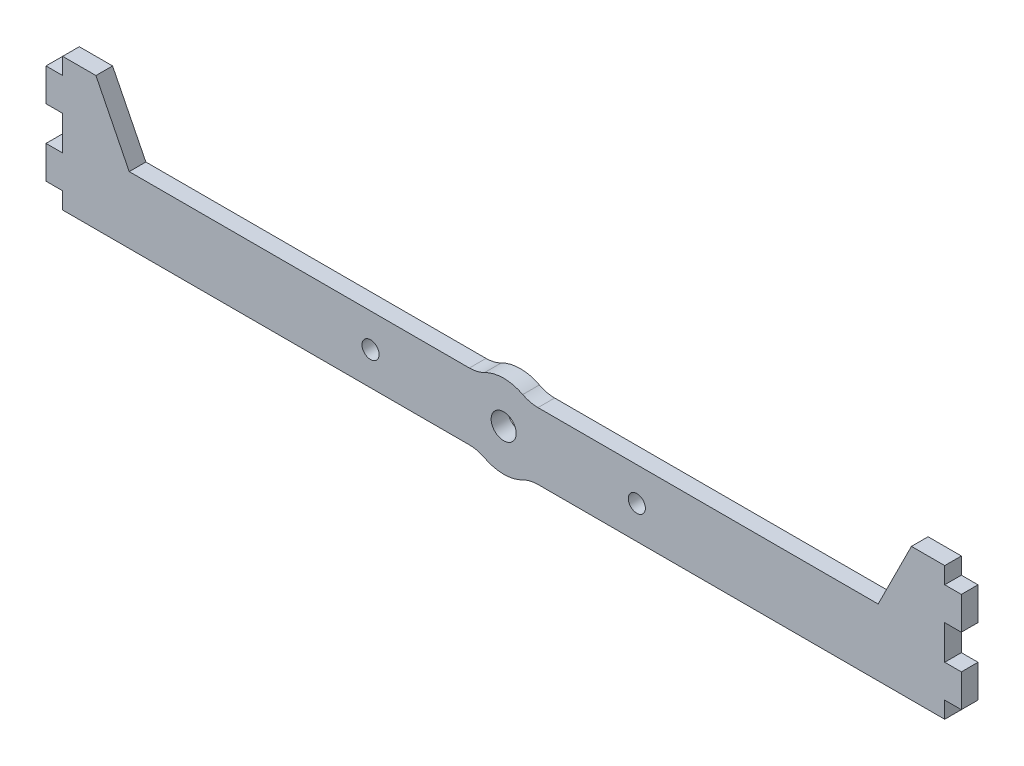
ISO-10303-21;
HEADER;
FILE_DESCRIPTION(('STEP AP214'),'2;1');
FILE_NAME('part.step','',(''),(''),'','','');
FILE_SCHEMA(('AUTOMOTIVE_DESIGN { 1 0 10303 214 1 1 1 1 }'));
ENDSEC;
DATA;
#1=APPLICATION_CONTEXT('core data for automotive mechanical design processes');
#2=APPLICATION_PROTOCOL_DEFINITION('international standard','automotive_design',2000,#1);
#3=PRODUCT_CONTEXT('',#1,'mechanical');
#4=PRODUCT('Part','Part','',(#3));
#5=PRODUCT_RELATED_PRODUCT_CATEGORY('part','',(#4));
#6=PRODUCT_DEFINITION_FORMATION('','',#4);
#7=PRODUCT_DEFINITION_CONTEXT('part definition',#1,'design');
#8=PRODUCT_DEFINITION('design','',#6,#7);
#9=PRODUCT_DEFINITION_SHAPE('','',#8);
#10=(LENGTH_UNIT() NAMED_UNIT(*) SI_UNIT(.MILLI.,.METRE.));
#11=(NAMED_UNIT(*) PLANE_ANGLE_UNIT() SI_UNIT($,.RADIAN.));
#12=(NAMED_UNIT(*) SI_UNIT($,.STERADIAN.) SOLID_ANGLE_UNIT());
#13=UNCERTAINTY_MEASURE_WITH_UNIT(LENGTH_MEASURE(1.E-05),#10,'distance_accuracy_value','');
#14=(GEOMETRIC_REPRESENTATION_CONTEXT(3) GLOBAL_UNCERTAINTY_ASSIGNED_CONTEXT((#13)) GLOBAL_UNIT_ASSIGNED_CONTEXT((#10,
#11,#12)) REPRESENTATION_CONTEXT('',''));
#15=CARTESIAN_POINT('',(0.,0.,0.));
#16=DIRECTION('',(0.,0.,1.));
#17=DIRECTION('',(1.,0.,0.));
#18=AXIS2_PLACEMENT_3D('',#15,#16,#17);
#19=CARTESIAN_POINT('',(0.,-12.7,6.35));
#20=DIRECTION('',(0.,-1.,0.));
#21=DIRECTION('',(1.,0.,0.));
#22=AXIS2_PLACEMENT_3D('',#19,#20,#21);
#23=PLANE('',#22);
#24=DIRECTION('',(-1.,0.,0.));
#25=VECTOR('',#24,1.);
#26=CARTESIAN_POINT('',(0.,-12.7,0.));
#27=LINE('',#26,#25);
#28=CARTESIAN_POINT('',(-13.0908603613361,-12.7,0.));
#29=VERTEX_POINT('',#28);
#30=CARTESIAN_POINT('',(-168.275,-12.7,0.));
#31=VERTEX_POINT('',#30);
#32=EDGE_CURVE('E337',#29,#31,#27,.T.);
#33=ORIENTED_EDGE('',*,*,#32,.F.);
#34=DIRECTION('',(0.,0.,-1.));
#35=VECTOR('',#34,1.);
#36=CARTESIAN_POINT('',(-13.0908603613361,-12.7,6.35));
#37=LINE('',#36,#35);
#38=CARTESIAN_POINT('',(-13.0908603613361,-12.7,6.35));
#39=VERTEX_POINT('',#38);
#40=EDGE_CURVE('E467',#29,#39,#37,.F.);
#41=ORIENTED_EDGE('',*,*,#40,.T.);
#42=DIRECTION('',(-1.,0.,0.));
#43=VECTOR('',#42,1.);
#44=CARTESIAN_POINT('',(0.,-12.7,6.35));
#45=LINE('',#44,#43);
#46=CARTESIAN_POINT('',(-168.275,-12.7,6.35));
#47=VERTEX_POINT('',#46);
#48=EDGE_CURVE('E273',#39,#47,#45,.T.);
#49=ORIENTED_EDGE('',*,*,#48,.T.);
#50=DIRECTION('',(0.,0.,-1.));
#51=VECTOR('',#50,1.);
#52=CARTESIAN_POINT('',(-168.275,-12.7,6.35));
#53=LINE('',#52,#51);
#54=EDGE_CURVE('E336',#47,#31,#53,.T.);
#55=ORIENTED_EDGE('',*,*,#54,.T.);
#56=EDGE_LOOP('',(#33,#41,#49,#55));
#57=FACE_BOUND('',#56,.T.);
#58=ADVANCED_FACE('F37',(#57),#23,.T.);
#59=CARTESIAN_POINT('',(0.,0.,6.35));
#60=DIRECTION('',(0.,0.,-1.));
#61=DIRECTION('',(-1.,0.,0.));
#62=AXIS2_PLACEMENT_3D('',#59,#60,#61);
#63=CYLINDRICAL_SURFACE('',#62,15.875);
#64=CARTESIAN_POINT('',(0.,0.,6.35));
#65=DIRECTION('',(0.,0.,1.));
#66=DIRECTION('',(1.,0.,0.));
#67=AXIS2_PLACEMENT_3D('',#64,#65,#66);
#68=CIRCLE('',#67,15.875);
#69=CARTESIAN_POINT('',(-7.27270020074232,-14.1111111111111,6.35));
#70=VERTEX_POINT('',#69);
#71=CARTESIAN_POINT('',(7.27270020074221,-14.1111111111111,6.35));
#72=VERTEX_POINT('',#71);
#73=EDGE_CURVE('E271',#70,#72,#68,.T.);
#74=ORIENTED_EDGE('',*,*,#73,.F.);
#75=DIRECTION('',(0.,0.,-1.));
#76=VECTOR('',#75,1.);
#77=CARTESIAN_POINT('',(-7.27270020074232,-14.1111111111111,6.35));
#78=LINE('',#77,#76);
#79=CARTESIAN_POINT('',(-7.27270020074232,-14.1111111111111,0.));
#80=VERTEX_POINT('',#79);
#81=EDGE_CURVE('E464',#70,#80,#78,.T.);
#82=ORIENTED_EDGE('',*,*,#81,.T.);
#83=CARTESIAN_POINT('',(0.,0.,0.));
#84=DIRECTION('',(0.,0.,1.));
#85=DIRECTION('',(1.,0.,0.));
#86=AXIS2_PLACEMENT_3D('',#83,#84,#85);
#87=CIRCLE('',#86,15.875);
#88=CARTESIAN_POINT('',(7.27270020074221,-14.1111111111111,0.));
#89=VERTEX_POINT('',#88);
#90=EDGE_CURVE('E339',#80,#89,#87,.T.);
#91=ORIENTED_EDGE('',*,*,#90,.T.);
#92=DIRECTION('',(0.,0.,-1.));
#93=VECTOR('',#92,1.);
#94=CARTESIAN_POINT('',(7.27270020074221,-14.1111111111111,6.35));
#95=LINE('',#94,#93);
#96=EDGE_CURVE('E256',#89,#72,#95,.F.);
#97=ORIENTED_EDGE('',*,*,#96,.T.);
#98=EDGE_LOOP('',(#74,#82,#91,#97));
#99=FACE_BOUND('',#98,.T.);
#100=ADVANCED_FACE('F556',(#99),#63,.T.);
#101=CARTESIAN_POINT('',(0.,-12.7,6.35));
#102=DIRECTION('',(0.,-1.,0.));
#103=DIRECTION('',(1.,0.,0.));
#104=AXIS2_PLACEMENT_3D('',#101,#102,#103);
#105=PLANE('',#104);
#106=DIRECTION('',(-1.,0.,0.));
#107=VECTOR('',#106,1.);
#108=CARTESIAN_POINT('',(0.,-12.7,6.35));
#109=LINE('',#108,#107);
#110=CARTESIAN_POINT('',(168.275,-12.7,6.35));
#111=VERTEX_POINT('',#110);
#112=CARTESIAN_POINT('',(13.090860361336,-12.7,6.35));
#113=VERTEX_POINT('',#112);
#114=EDGE_CURVE('E250',#111,#113,#109,.T.);
#115=ORIENTED_EDGE('',*,*,#114,.T.);
#116=DIRECTION('',(0.,0.,-1.));
#117=VECTOR('',#116,1.);
#118=CARTESIAN_POINT('',(13.090860361336,-12.7,6.35));
#119=LINE('',#118,#117);
#120=CARTESIAN_POINT('',(13.090860361336,-12.7,0.));
#121=VERTEX_POINT('',#120);
#122=EDGE_CURVE('E469',#113,#121,#119,.T.);
#123=ORIENTED_EDGE('',*,*,#122,.T.);
#124=DIRECTION('',(-1.,0.,0.));
#125=VECTOR('',#124,1.);
#126=CARTESIAN_POINT('',(0.,-12.7,0.));
#127=LINE('',#126,#125);
#128=CARTESIAN_POINT('',(168.275,-12.7,0.));
#129=VERTEX_POINT('',#128);
#130=EDGE_CURVE('E253',#129,#121,#127,.T.);
#131=ORIENTED_EDGE('',*,*,#130,.F.);
#132=DIRECTION('',(0.,0.,-1.));
#133=VECTOR('',#132,1.);
#134=CARTESIAN_POINT('',(168.275,-12.7,6.35));
#135=LINE('',#134,#133);
#136=EDGE_CURVE('E245',#111,#129,#135,.T.);
#137=ORIENTED_EDGE('',*,*,#136,.F.);
#138=EDGE_LOOP('',(#115,#123,#131,#137));
#139=FACE_BOUND('',#138,.T.);
#140=ADVANCED_FACE('F247',(#139),#105,.T.);
#141=CARTESIAN_POINT('',(168.275,-2.94209101525652E-12,6.35));
#142=DIRECTION('',(-1.,0.,0.));
#143=DIRECTION('',(0.,-1.,0.));
#144=AXIS2_PLACEMENT_3D('',#141,#142,#143);
#145=PLANE('',#144);
#146=DIRECTION('',(0.,1.,0.));
#147=VECTOR('',#146,1.);
#148=CARTESIAN_POINT('',(168.275,-2.94209101525652E-12,0.));
#149=LINE('',#148,#147);
#150=CARTESIAN_POINT('',(168.275,-6.34999999999966,0.));
#151=VERTEX_POINT('',#150);
#152=EDGE_CURVE('E344',#129,#151,#149,.T.);
#153=ORIENTED_EDGE('',*,*,#152,.T.);
#154=DIRECTION('',(0.,0.,-1.));
#155=VECTOR('',#154,1.);
#156=CARTESIAN_POINT('',(168.275,-6.34999999999966,6.35));
#157=LINE('',#156,#155);
#158=CARTESIAN_POINT('',(168.275,-6.34999999999966,6.35));
#159=VERTEX_POINT('',#158);
#160=EDGE_CURVE('E257',#159,#151,#157,.T.);
#161=ORIENTED_EDGE('',*,*,#160,.F.);
#162=DIRECTION('',(0.,1.,0.));
#163=VECTOR('',#162,1.);
#164=CARTESIAN_POINT('',(168.275,-2.94209101525652E-12,6.35));
#165=LINE('',#164,#163);
#166=EDGE_CURVE('E260',#111,#159,#165,.T.);
#167=ORIENTED_EDGE('',*,*,#166,.F.);
#168=ORIENTED_EDGE('',*,*,#136,.T.);
#169=EDGE_LOOP('',(#153,#161,#167,#168));
#170=FACE_BOUND('',#169,.T.);
#171=ADVANCED_FACE('F261',(#170),#145,.F.);
#172=CARTESIAN_POINT('',(0.,-6.35000000000003,6.35));
#173=DIRECTION('',(0.,1.,0.));
#174=DIRECTION('',(-1.,0.,0.));
#175=AXIS2_PLACEMENT_3D('',#172,#173,#174);
#176=PLANE('',#175);
#177=DIRECTION('',(1.,0.,0.));
#178=VECTOR('',#177,1.);
#179=CARTESIAN_POINT('',(0.,-6.35000000000003,0.));
#180=LINE('',#179,#178);
#181=CARTESIAN_POINT('',(174.625,-6.34999999999965,0.));
#182=VERTEX_POINT('',#181);
#183=EDGE_CURVE('E346',#151,#182,#180,.T.);
#184=ORIENTED_EDGE('',*,*,#183,.T.);
#185=DIRECTION('',(0.,0.,-1.));
#186=VECTOR('',#185,1.);
#187=CARTESIAN_POINT('',(174.625,-6.34999999999965,6.35));
#188=LINE('',#187,#186);
#189=CARTESIAN_POINT('',(174.625,-6.34999999999965,6.35));
#190=VERTEX_POINT('',#189);
#191=EDGE_CURVE('E459',#190,#182,#188,.T.);
#192=ORIENTED_EDGE('',*,*,#191,.F.);
#193=DIRECTION('',(1.,0.,0.));
#194=VECTOR('',#193,1.);
#195=CARTESIAN_POINT('',(0.,-6.35000000000003,6.35));
#196=LINE('',#195,#194);
#197=EDGE_CURVE('E264',#159,#190,#196,.T.);
#198=ORIENTED_EDGE('',*,*,#197,.F.);
#199=ORIENTED_EDGE('',*,*,#160,.T.);
#200=EDGE_LOOP('',(#184,#192,#198,#199));
#201=FACE_BOUND('',#200,.T.);
#202=ADVANCED_FACE('F582',(#201),#176,.F.);
#203=CARTESIAN_POINT('',(174.625,7.75490782700672E-13,6.35));
#204=DIRECTION('',(-1.,0.,0.));
#205=DIRECTION('',(0.,-1.,0.));
#206=AXIS2_PLACEMENT_3D('',#203,#204,#205);
#207=PLANE('',#206);
#208=DIRECTION('',(0.,1.,0.));
#209=VECTOR('',#208,1.);
#210=CARTESIAN_POINT('',(174.625,7.75490782700672E-13,0.));
#211=LINE('',#210,#209);
#212=CARTESIAN_POINT('',(174.625,6.15000000000035,0.));
#213=VERTEX_POINT('',#212);
#214=EDGE_CURVE('E348',#182,#213,#211,.T.);
#215=ORIENTED_EDGE('',*,*,#214,.T.);
#216=DIRECTION('',(0.,0.,-1.));
#217=VECTOR('',#216,1.);
#218=CARTESIAN_POINT('',(174.625,6.15000000000035,6.35));
#219=LINE('',#218,#217);
#220=CARTESIAN_POINT('',(174.625,6.15000000000035,6.35));
#221=VERTEX_POINT('',#220);
#222=EDGE_CURVE('E457',#221,#213,#219,.T.);
#223=ORIENTED_EDGE('',*,*,#222,.F.);
#224=DIRECTION('',(0.,1.,0.));
#225=VECTOR('',#224,1.);
#226=CARTESIAN_POINT('',(174.625,7.75490782700672E-13,6.35));
#227=LINE('',#226,#225);
#228=EDGE_CURVE('E278',#190,#221,#227,.T.);
#229=ORIENTED_EDGE('',*,*,#228,.F.);
#230=ORIENTED_EDGE('',*,*,#191,.T.);
#231=EDGE_LOOP('',(#215,#223,#229,#230));
#232=FACE_BOUND('',#231,.T.);
#233=ADVANCED_FACE('F585',(#232),#207,.F.);
#234=CARTESIAN_POINT('',(0.,6.15000000000002,6.35));
#235=DIRECTION('',(0.,1.,0.));
#236=DIRECTION('',(-1.,0.,0.));
#237=AXIS2_PLACEMENT_3D('',#234,#235,#236);
#238=PLANE('',#237);
#239=DIRECTION('',(1.,0.,0.));
#240=VECTOR('',#239,1.);
#241=CARTESIAN_POINT('',(0.,6.15000000000002,0.));
#242=LINE('',#241,#240);
#243=CARTESIAN_POINT('',(168.275,6.15000000000034,0.));
#244=VERTEX_POINT('',#243);
#245=EDGE_CURVE('E351',#244,#213,#242,.T.);
#246=ORIENTED_EDGE('',*,*,#245,.F.);
#247=DIRECTION('',(0.,0.,-1.));
#248=VECTOR('',#247,1.);
#249=CARTESIAN_POINT('',(168.275,6.15000000000034,6.35));
#250=LINE('',#249,#248);
#251=CARTESIAN_POINT('',(168.275,6.15000000000034,6.35));
#252=VERTEX_POINT('',#251);
#253=EDGE_CURVE('E455',#252,#244,#250,.T.);
#254=ORIENTED_EDGE('',*,*,#253,.F.);
#255=DIRECTION('',(1.,0.,0.));
#256=VECTOR('',#255,1.);
#257=CARTESIAN_POINT('',(0.,6.15000000000002,6.35));
#258=LINE('',#257,#256);
#259=EDGE_CURVE('E280',#252,#221,#258,.T.);
#260=ORIENTED_EDGE('',*,*,#259,.T.);
#261=ORIENTED_EDGE('',*,*,#222,.T.);
#262=EDGE_LOOP('',(#246,#254,#260,#261));
#263=FACE_BOUND('',#262,.T.);
#264=ADVANCED_FACE('F589',(#263),#238,.T.);
#265=CARTESIAN_POINT('',(168.275,1.42612808754815E-12,6.35));
#266=DIRECTION('',(-1.,0.,0.));
#267=DIRECTION('',(0.,-1.,0.));
#268=AXIS2_PLACEMENT_3D('',#265,#266,#267);
#269=PLANE('',#268);
#270=DIRECTION('',(0.,1.,0.));
#271=VECTOR('',#270,1.);
#272=CARTESIAN_POINT('',(168.275,1.42612808754815E-12,0.));
#273=LINE('',#272,#271);
#274=CARTESIAN_POINT('',(168.275,19.2500000000003,0.));
#275=VERTEX_POINT('',#274);
#276=EDGE_CURVE('E354',#244,#275,#273,.T.);
#277=ORIENTED_EDGE('',*,*,#276,.T.);
#278=DIRECTION('',(0.,0.,-1.));
#279=VECTOR('',#278,1.);
#280=CARTESIAN_POINT('',(168.275,19.2500000000003,6.35));
#281=LINE('',#280,#279);
#282=CARTESIAN_POINT('',(168.275,19.2500000000003,6.35));
#283=VERTEX_POINT('',#282);
#284=EDGE_CURVE('E452',#283,#275,#281,.T.);
#285=ORIENTED_EDGE('',*,*,#284,.F.);
#286=DIRECTION('',(0.,1.,0.));
#287=VECTOR('',#286,1.);
#288=CARTESIAN_POINT('',(168.275,1.42612808754815E-12,6.35));
#289=LINE('',#288,#287);
#290=EDGE_CURVE('E283',#252,#283,#289,.T.);
#291=ORIENTED_EDGE('',*,*,#290,.F.);
#292=ORIENTED_EDGE('',*,*,#253,.T.);
#293=EDGE_LOOP('',(#277,#285,#291,#292));
#294=FACE_BOUND('',#293,.T.);
#295=ADVANCED_FACE('F593',(#294),#269,.F.);
#296=CARTESIAN_POINT('',(0.,19.25,6.35));
#297=DIRECTION('',(0.,1.,0.));
#298=DIRECTION('',(-1.,0.,0.));
#299=AXIS2_PLACEMENT_3D('',#296,#297,#298);
#300=PLANE('',#299);
#301=DIRECTION('',(1.,0.,0.));
#302=VECTOR('',#301,1.);
#303=CARTESIAN_POINT('',(0.,19.25,0.));
#304=LINE('',#303,#302);
#305=CARTESIAN_POINT('',(174.625,19.2500000000004,0.));
#306=VERTEX_POINT('',#305);
#307=EDGE_CURVE('E356',#275,#306,#304,.T.);
#308=ORIENTED_EDGE('',*,*,#307,.T.);
#309=DIRECTION('',(0.,0.,-1.));
#310=VECTOR('',#309,1.);
#311=CARTESIAN_POINT('',(174.625,19.2500000000004,6.35));
#312=LINE('',#311,#310);
#313=CARTESIAN_POINT('',(174.625,19.2500000000004,6.35));
#314=VERTEX_POINT('',#313);
#315=EDGE_CURVE('E450',#314,#306,#312,.T.);
#316=ORIENTED_EDGE('',*,*,#315,.F.);
#317=DIRECTION('',(1.,0.,0.));
#318=VECTOR('',#317,1.);
#319=CARTESIAN_POINT('',(0.,19.25,6.35));
#320=LINE('',#319,#318);
#321=EDGE_CURVE('E285',#283,#314,#320,.T.);
#322=ORIENTED_EDGE('',*,*,#321,.F.);
#323=ORIENTED_EDGE('',*,*,#284,.T.);
#324=EDGE_LOOP('',(#308,#316,#322,#323));
#325=FACE_BOUND('',#324,.T.);
#326=ADVANCED_FACE('F597',(#325),#300,.F.);
#327=CARTESIAN_POINT('',(174.625,7.75490782700672E-13,6.35));
#328=DIRECTION('',(1.,0.,0.));
#329=DIRECTION('',(0.,1.,0.));
#330=AXIS2_PLACEMENT_3D('',#327,#328,#329);
#331=PLANE('',#330);
#332=DIRECTION('',(0.,-1.,0.));
#333=VECTOR('',#332,1.);
#334=CARTESIAN_POINT('',(174.625,7.75490782700672E-13,0.));
#335=LINE('',#334,#333);
#336=CARTESIAN_POINT('',(174.625,31.7500000000004,0.));
#337=VERTEX_POINT('',#336);
#338=EDGE_CURVE('E359',#337,#306,#335,.T.);
#339=ORIENTED_EDGE('',*,*,#338,.F.);
#340=DIRECTION('',(0.,0.,-1.));
#341=VECTOR('',#340,1.);
#342=CARTESIAN_POINT('',(174.625,31.7500000000004,6.35));
#343=LINE('',#342,#341);
#344=CARTESIAN_POINT('',(174.625,31.7500000000004,6.35));
#345=VERTEX_POINT('',#344);
#346=EDGE_CURVE('E448',#345,#337,#343,.T.);
#347=ORIENTED_EDGE('',*,*,#346,.F.);
#348=DIRECTION('',(0.,-1.,0.));
#349=VECTOR('',#348,1.);
#350=CARTESIAN_POINT('',(174.625,7.75490782700672E-13,6.35));
#351=LINE('',#350,#349);
#352=EDGE_CURVE('E287',#345,#314,#351,.T.);
#353=ORIENTED_EDGE('',*,*,#352,.T.);
#354=ORIENTED_EDGE('',*,*,#315,.T.);
#355=EDGE_LOOP('',(#339,#347,#353,#354));
#356=FACE_BOUND('',#355,.T.);
#357=ADVANCED_FACE('F601',(#356),#331,.T.);
#358=CARTESIAN_POINT('',(0.,31.75,6.35));
#359=DIRECTION('',(0.,1.,0.));
#360=DIRECTION('',(-1.,0.,0.));
#361=AXIS2_PLACEMENT_3D('',#358,#359,#360);
#362=PLANE('',#361);
#363=DIRECTION('',(1.,0.,0.));
#364=VECTOR('',#363,1.);
#365=CARTESIAN_POINT('',(0.,31.75,0.));
#366=LINE('',#365,#364);
#367=CARTESIAN_POINT('',(168.275,31.7500000000003,0.));
#368=VERTEX_POINT('',#367);
#369=EDGE_CURVE('E362',#368,#337,#366,.T.);
#370=ORIENTED_EDGE('',*,*,#369,.F.);
#371=DIRECTION('',(0.,0.,-1.));
#372=VECTOR('',#371,1.);
#373=CARTESIAN_POINT('',(168.275,31.7500000000003,6.35));
#374=LINE('',#373,#372);
#375=CARTESIAN_POINT('',(168.275,31.7500000000003,6.35));
#376=VERTEX_POINT('',#375);
#377=EDGE_CURVE('E446',#376,#368,#374,.T.);
#378=ORIENTED_EDGE('',*,*,#377,.F.);
#379=DIRECTION('',(1.,0.,0.));
#380=VECTOR('',#379,1.);
#381=CARTESIAN_POINT('',(0.,31.75,6.35));
#382=LINE('',#381,#380);
#383=EDGE_CURVE('E290',#376,#345,#382,.T.);
#384=ORIENTED_EDGE('',*,*,#383,.T.);
#385=ORIENTED_EDGE('',*,*,#346,.T.);
#386=EDGE_LOOP('',(#370,#378,#384,#385));
#387=FACE_BOUND('',#386,.T.);
#388=ADVANCED_FACE('F605',(#387),#362,.T.);
#389=CARTESIAN_POINT('',(168.275,0.,6.35));
#390=DIRECTION('',(-1.,0.,0.));
#391=DIRECTION('',(0.,0.,1.));
#392=AXIS2_PLACEMENT_3D('',#389,#390,#391);
#393=PLANE('',#392);
#394=DIRECTION('',(0.,1.,0.));
#395=VECTOR('',#394,1.);
#396=CARTESIAN_POINT('',(168.275,0.,0.));
#397=LINE('',#396,#395);
#398=CARTESIAN_POINT('',(168.275,38.1000000000003,0.));
#399=VERTEX_POINT('',#398);
#400=EDGE_CURVE('E365',#368,#399,#397,.T.);
#401=ORIENTED_EDGE('',*,*,#400,.T.);
#402=DIRECTION('',(0.,0.,-1.));
#403=VECTOR('',#402,1.);
#404=CARTESIAN_POINT('',(168.275,38.1000000000003,6.35));
#405=LINE('',#404,#403);
#406=CARTESIAN_POINT('',(168.275,38.1000000000003,6.35));
#407=VERTEX_POINT('',#406);
#408=EDGE_CURVE('E443',#407,#399,#405,.T.);
#409=ORIENTED_EDGE('',*,*,#408,.F.);
#410=DIRECTION('',(0.,1.,0.));
#411=VECTOR('',#410,1.);
#412=CARTESIAN_POINT('',(168.275,0.,6.35));
#413=LINE('',#412,#411);
#414=EDGE_CURVE('E293',#376,#407,#413,.T.);
#415=ORIENTED_EDGE('',*,*,#414,.F.);
#416=ORIENTED_EDGE('',*,*,#377,.T.);
#417=EDGE_LOOP('',(#401,#409,#415,#416));
#418=FACE_BOUND('',#417,.T.);
#419=ADVANCED_FACE('F609',(#418),#393,.F.);
#420=CARTESIAN_POINT('',(0.,38.1,6.35));
#421=DIRECTION('',(0.,-1.,0.));
#422=DIRECTION('',(1.,0.,0.));
#423=AXIS2_PLACEMENT_3D('',#420,#421,#422);
#424=PLANE('',#423);
#425=DIRECTION('',(-1.,0.,0.));
#426=VECTOR('',#425,1.);
#427=CARTESIAN_POINT('',(0.,38.1,0.));
#428=LINE('',#427,#426);
#429=CARTESIAN_POINT('',(155.575,38.1000000000003,0.));
#430=VERTEX_POINT('',#429);
#431=EDGE_CURVE('E367',#399,#430,#428,.T.);
#432=ORIENTED_EDGE('',*,*,#431,.T.);
#433=DIRECTION('',(0.,0.,-1.));
#434=VECTOR('',#433,1.);
#435=CARTESIAN_POINT('',(155.575,38.1000000000003,6.35));
#436=LINE('',#435,#434);
#437=CARTESIAN_POINT('',(155.575,38.1000000000003,6.35));
#438=VERTEX_POINT('',#437);
#439=EDGE_CURVE('E440',#438,#430,#436,.T.);
#440=ORIENTED_EDGE('',*,*,#439,.F.);
#441=DIRECTION('',(-1.,0.,0.));
#442=VECTOR('',#441,1.);
#443=CARTESIAN_POINT('',(0.,38.1,6.35));
#444=LINE('',#443,#442);
#445=EDGE_CURVE('E295',#407,#438,#444,.T.);
#446=ORIENTED_EDGE('',*,*,#445,.F.);
#447=ORIENTED_EDGE('',*,*,#408,.T.);
#448=EDGE_LOOP('',(#432,#440,#446,#447));
#449=FACE_BOUND('',#448,.T.);
#450=ADVANCED_FACE('F613',(#449),#424,.F.);
#451=CARTESIAN_POINT('',(109.220000000001,-54.6099999999995,6.35));
#452=DIRECTION('',(0.894427190999919,-0.447213595499952,0.));
#453=DIRECTION('',(0.447213595499953,0.894427190999919,0.));
#454=AXIS2_PLACEMENT_3D('',#451,#452,#453);
#455=PLANE('',#454);
#456=DIRECTION('',(-0.447213595499953,-0.894427190999919,0.));
#457=VECTOR('',#456,1.);
#458=CARTESIAN_POINT('',(109.220000000001,-54.6099999999995,0.));
#459=LINE('',#458,#457);
#460=CARTESIAN_POINT('',(142.875,12.7,0.));
#461=VERTEX_POINT('',#460);
#462=EDGE_CURVE('E369',#430,#461,#459,.T.);
#463=ORIENTED_EDGE('',*,*,#462,.T.);
#464=DIRECTION('',(0.,0.,-1.));
#465=VECTOR('',#464,1.);
#466=CARTESIAN_POINT('',(142.875,12.7,6.35));
#467=LINE('',#466,#465);
#468=CARTESIAN_POINT('',(142.875,12.7,6.35));
#469=VERTEX_POINT('',#468);
#470=EDGE_CURVE('E437',#469,#461,#467,.T.);
#471=ORIENTED_EDGE('',*,*,#470,.F.);
#472=DIRECTION('',(-0.447213595499953,-0.894427190999919,0.));
#473=VECTOR('',#472,1.);
#474=CARTESIAN_POINT('',(109.220000000001,-54.6099999999995,6.35));
#475=LINE('',#474,#473);
#476=EDGE_CURVE('E297',#438,#469,#475,.T.);
#477=ORIENTED_EDGE('',*,*,#476,.F.);
#478=ORIENTED_EDGE('',*,*,#439,.T.);
#479=EDGE_LOOP('',(#463,#471,#477,#478));
#480=FACE_BOUND('',#479,.T.);
#481=ADVANCED_FACE('F617',(#480),#455,.F.);
#482=CARTESIAN_POINT('',(0.,12.7,6.35));
#483=DIRECTION('',(0.,-1.,0.));
#484=DIRECTION('',(1.,0.,0.));
#485=AXIS2_PLACEMENT_3D('',#482,#483,#484);
#486=PLANE('',#485);
#487=DIRECTION('',(-1.,0.,0.));
#488=VECTOR('',#487,1.);
#489=CARTESIAN_POINT('',(0.,12.7,0.));
#490=LINE('',#489,#488);
#491=CARTESIAN_POINT('',(13.090860361336,12.7,0.));
#492=VERTEX_POINT('',#491);
#493=EDGE_CURVE('E371',#461,#492,#490,.T.);
#494=ORIENTED_EDGE('',*,*,#493,.T.);
#495=DIRECTION('',(0.,0.,1.));
#496=VECTOR('',#495,1.);
#497=CARTESIAN_POINT('',(13.090860361336,12.7,6.35));
#498=LINE('',#497,#496);
#499=CARTESIAN_POINT('',(13.090860361336,12.7,6.35));
#500=VERTEX_POINT('',#499);
#501=EDGE_CURVE('E476',#492,#500,#498,.T.);
#502=ORIENTED_EDGE('',*,*,#501,.T.);
#503=DIRECTION('',(-1.,0.,0.));
#504=VECTOR('',#503,1.);
#505=CARTESIAN_POINT('',(0.,12.7,6.35));
#506=LINE('',#505,#504);
#507=EDGE_CURVE('E299',#469,#500,#506,.T.);
#508=ORIENTED_EDGE('',*,*,#507,.F.);
#509=ORIENTED_EDGE('',*,*,#470,.T.);
#510=EDGE_LOOP('',(#494,#502,#508,#509));
#511=FACE_BOUND('',#510,.T.);
#512=ADVANCED_FACE('F621',(#511),#486,.F.);
#513=CARTESIAN_POINT('',(0.,0.,6.35));
#514=DIRECTION('',(0.,0.,-1.));
#515=DIRECTION('',(-1.,0.,0.));
#516=AXIS2_PLACEMENT_3D('',#513,#514,#515);
#517=CYLINDRICAL_SURFACE('',#516,15.875);
#518=CARTESIAN_POINT('',(0.,0.,6.35));
#519=DIRECTION('',(0.,0.,1.));
#520=DIRECTION('',(1.,0.,0.));
#521=AXIS2_PLACEMENT_3D('',#518,#519,#520);
#522=CIRCLE('',#521,15.875);
#523=CARTESIAN_POINT('',(7.27270020074221,14.1111111111111,6.35));
#524=VERTEX_POINT('',#523);
#525=CARTESIAN_POINT('',(-7.27270020074233,14.1111111111111,6.35));
#526=VERTEX_POINT('',#525);
#527=EDGE_CURVE('E302',#524,#526,#522,.T.);
#528=ORIENTED_EDGE('',*,*,#527,.F.);
#529=DIRECTION('',(0.,0.,-1.));
#530=VECTOR('',#529,1.);
#531=CARTESIAN_POINT('',(7.27270020074221,14.1111111111111,6.35));
#532=LINE('',#531,#530);
#533=CARTESIAN_POINT('',(7.27270020074221,14.1111111111111,0.));
#534=VERTEX_POINT('',#533);
#535=EDGE_CURVE('E473',#524,#534,#532,.T.);
#536=ORIENTED_EDGE('',*,*,#535,.T.);
#537=CARTESIAN_POINT('',(0.,0.,0.));
#538=DIRECTION('',(0.,0.,1.));
#539=DIRECTION('',(1.,0.,0.));
#540=AXIS2_PLACEMENT_3D('',#537,#538,#539);
#541=CIRCLE('',#540,15.875);
#542=CARTESIAN_POINT('',(-7.27270020074233,14.1111111111111,0.));
#543=VERTEX_POINT('',#542);
#544=EDGE_CURVE('E374',#534,#543,#541,.T.);
#545=ORIENTED_EDGE('',*,*,#544,.T.);
#546=DIRECTION('',(0.,0.,-1.));
#547=VECTOR('',#546,1.);
#548=CARTESIAN_POINT('',(-7.27270020074233,14.1111111111111,6.35));
#549=LINE('',#548,#547);
#550=EDGE_CURVE('E471',#543,#526,#549,.F.);
#551=ORIENTED_EDGE('',*,*,#550,.T.);
#552=EDGE_LOOP('',(#528,#536,#545,#551));
#553=FACE_BOUND('',#552,.T.);
#554=ADVANCED_FACE('F497',(#553),#517,.T.);
#555=CARTESIAN_POINT('',(0.,12.7,6.35));
#556=DIRECTION('',(0.,-1.,0.));
#557=DIRECTION('',(1.,0.,0.));
#558=AXIS2_PLACEMENT_3D('',#555,#556,#557);
#559=PLANE('',#558);
#560=DIRECTION('',(-1.,0.,0.));
#561=VECTOR('',#560,1.);
#562=CARTESIAN_POINT('',(0.,12.7,6.35));
#563=LINE('',#562,#561);
#564=CARTESIAN_POINT('',(-13.0908603613361,12.7,6.35));
#565=VERTEX_POINT('',#564);
#566=CARTESIAN_POINT('',(-142.875,12.7,6.35));
#567=VERTEX_POINT('',#566);
#568=EDGE_CURVE('E304',#565,#567,#563,.T.);
#569=ORIENTED_EDGE('',*,*,#568,.F.);
#570=DIRECTION('',(0.,0.,1.));
#571=VECTOR('',#570,1.);
#572=CARTESIAN_POINT('',(-13.0908603613361,12.7,0.));
#573=LINE('',#572,#571);
#574=CARTESIAN_POINT('',(-13.0908603613361,12.7,0.));
#575=VERTEX_POINT('',#574);
#576=EDGE_CURVE('E478',#565,#575,#573,.F.);
#577=ORIENTED_EDGE('',*,*,#576,.T.);
#578=DIRECTION('',(-1.,0.,0.));
#579=VECTOR('',#578,1.);
#580=CARTESIAN_POINT('',(0.,12.7,0.));
#581=LINE('',#580,#579);
#582=CARTESIAN_POINT('',(-142.875,12.7,0.));
#583=VERTEX_POINT('',#582);
#584=EDGE_CURVE('E377',#575,#583,#581,.T.);
#585=ORIENTED_EDGE('',*,*,#584,.T.);
#586=DIRECTION('',(0.,0.,-1.));
#587=VECTOR('',#586,1.);
#588=CARTESIAN_POINT('',(-142.875,12.7,6.35));
#589=LINE('',#588,#587);
#590=EDGE_CURVE('E434',#567,#583,#589,.T.);
#591=ORIENTED_EDGE('',*,*,#590,.F.);
#592=EDGE_LOOP('',(#569,#577,#585,#591));
#593=FACE_BOUND('',#592,.T.);
#594=ADVANCED_FACE('F500',(#593),#559,.F.);
#595=CARTESIAN_POINT('',(-109.22,-54.61,6.35));
#596=DIRECTION('',(0.894427190999916,0.447213595499958,0.));
#597=DIRECTION('',(-0.447213595499958,0.894427190999916,0.));
#598=AXIS2_PLACEMENT_3D('',#595,#596,#597);
#599=PLANE('',#598);
#600=DIRECTION('',(0.447213595499958,-0.894427190999916,0.));
#601=VECTOR('',#600,1.);
#602=CARTESIAN_POINT('',(-109.22,-54.61,0.));
#603=LINE('',#602,#601);
#604=CARTESIAN_POINT('',(-155.575,38.1,0.));
#605=VERTEX_POINT('',#604);
#606=EDGE_CURVE('E379',#605,#583,#603,.T.);
#607=ORIENTED_EDGE('',*,*,#606,.F.);
#608=DIRECTION('',(0.,0.,-1.));
#609=VECTOR('',#608,1.);
#610=CARTESIAN_POINT('',(-155.575,38.1,6.35));
#611=LINE('',#610,#609);
#612=CARTESIAN_POINT('',(-155.575,38.1,6.35));
#613=VERTEX_POINT('',#612);
#614=EDGE_CURVE('E432',#613,#605,#611,.T.);
#615=ORIENTED_EDGE('',*,*,#614,.F.);
#616=DIRECTION('',(0.447213595499958,-0.894427190999916,0.));
#617=VECTOR('',#616,1.);
#618=CARTESIAN_POINT('',(-109.22,-54.61,6.35));
#619=LINE('',#618,#617);
#620=EDGE_CURVE('E306',#613,#567,#619,.T.);
#621=ORIENTED_EDGE('',*,*,#620,.T.);
#622=ORIENTED_EDGE('',*,*,#590,.T.);
#623=EDGE_LOOP('',(#607,#615,#621,#622));
#624=FACE_BOUND('',#623,.T.);
#625=ADVANCED_FACE('F630',(#624),#599,.T.);
#626=CARTESIAN_POINT('',(0.,38.1,6.35));
#627=DIRECTION('',(0.,1.,0.));
#628=DIRECTION('',(0.,0.,1.));
#629=AXIS2_PLACEMENT_3D('',#626,#627,#628);
#630=PLANE('',#629);
#631=DIRECTION('',(1.,0.,0.));
#632=VECTOR('',#631,1.);
#633=CARTESIAN_POINT('',(0.,38.1,0.));
#634=LINE('',#633,#632);
#635=CARTESIAN_POINT('',(-168.275,38.1,0.));
#636=VERTEX_POINT('',#635);
#637=EDGE_CURVE('E382',#636,#605,#634,.T.);
#638=ORIENTED_EDGE('',*,*,#637,.F.);
#639=DIRECTION('',(0.,0.,-1.));
#640=VECTOR('',#639,1.);
#641=CARTESIAN_POINT('',(-168.275,38.1,6.35));
#642=LINE('',#641,#640);
#643=CARTESIAN_POINT('',(-168.275,38.1,6.35));
#644=VERTEX_POINT('',#643);
#645=EDGE_CURVE('E430',#644,#636,#642,.T.);
#646=ORIENTED_EDGE('',*,*,#645,.F.);
#647=DIRECTION('',(1.,0.,0.));
#648=VECTOR('',#647,1.);
#649=CARTESIAN_POINT('',(0.,38.1,6.35));
#650=LINE('',#649,#648);
#651=EDGE_CURVE('E309',#644,#613,#650,.T.);
#652=ORIENTED_EDGE('',*,*,#651,.T.);
#653=ORIENTED_EDGE('',*,*,#614,.T.);
#654=EDGE_LOOP('',(#638,#646,#652,#653));
#655=FACE_BOUND('',#654,.T.);
#656=ADVANCED_FACE('F508',(#655),#630,.T.);
#657=CARTESIAN_POINT('',(-168.275,0.,6.35));
#658=DIRECTION('',(-1.,0.,0.));
#659=DIRECTION('',(0.,0.,1.));
#660=AXIS2_PLACEMENT_3D('',#657,#658,#659);
#661=PLANE('',#660);
#662=DIRECTION('',(0.,1.,0.));
#663=VECTOR('',#662,1.);
#664=CARTESIAN_POINT('',(-168.275,0.,0.));
#665=LINE('',#664,#663);
#666=CARTESIAN_POINT('',(-168.275,31.75,0.));
#667=VERTEX_POINT('',#666);
#668=EDGE_CURVE('E385',#667,#636,#665,.T.);
#669=ORIENTED_EDGE('',*,*,#668,.F.);
#670=DIRECTION('',(0.,0.,-1.));
#671=VECTOR('',#670,1.);
#672=CARTESIAN_POINT('',(-168.275,31.75,6.35));
#673=LINE('',#672,#671);
#674=CARTESIAN_POINT('',(-168.275,31.75,6.35));
#675=VERTEX_POINT('',#674);
#676=EDGE_CURVE('E428',#675,#667,#673,.T.);
#677=ORIENTED_EDGE('',*,*,#676,.F.);
#678=DIRECTION('',(0.,1.,0.));
#679=VECTOR('',#678,1.);
#680=CARTESIAN_POINT('',(-168.275,0.,6.35));
#681=LINE('',#680,#679);
#682=EDGE_CURVE('E312',#675,#644,#681,.T.);
#683=ORIENTED_EDGE('',*,*,#682,.T.);
#684=ORIENTED_EDGE('',*,*,#645,.T.);
#685=EDGE_LOOP('',(#669,#677,#683,#684));
#686=FACE_BOUND('',#685,.T.);
#687=ADVANCED_FACE('F512',(#686),#661,.T.);
#688=CARTESIAN_POINT('',(0.,31.75,6.35));
#689=DIRECTION('',(0.,-1.,0.));
#690=DIRECTION('',(0.,0.,-1.));
#691=AXIS2_PLACEMENT_3D('',#688,#689,#690);
#692=PLANE('',#691);
#693=DIRECTION('',(-1.,0.,0.));
#694=VECTOR('',#693,1.);
#695=CARTESIAN_POINT('',(0.,31.75,0.));
#696=LINE('',#695,#694);
#697=CARTESIAN_POINT('',(-174.625,31.75,0.));
#698=VERTEX_POINT('',#697);
#699=EDGE_CURVE('E388',#667,#698,#696,.T.);
#700=ORIENTED_EDGE('',*,*,#699,.T.);
#701=DIRECTION('',(0.,0.,-1.));
#702=VECTOR('',#701,1.);
#703=CARTESIAN_POINT('',(-174.625,31.75,6.35));
#704=LINE('',#703,#702);
#705=CARTESIAN_POINT('',(-174.625,31.75,6.35));
#706=VERTEX_POINT('',#705);
#707=EDGE_CURVE('E425',#706,#698,#704,.T.);
#708=ORIENTED_EDGE('',*,*,#707,.F.);
#709=DIRECTION('',(-1.,0.,0.));
#710=VECTOR('',#709,1.);
#711=CARTESIAN_POINT('',(0.,31.75,6.35));
#712=LINE('',#711,#710);
#713=EDGE_CURVE('E315',#675,#706,#712,.T.);
#714=ORIENTED_EDGE('',*,*,#713,.F.);
#715=ORIENTED_EDGE('',*,*,#676,.T.);
#716=EDGE_LOOP('',(#700,#708,#714,#715));
#717=FACE_BOUND('',#716,.T.);
#718=ADVANCED_FACE('F519',(#717),#692,.F.);
#719=CARTESIAN_POINT('',(-174.625,0.,6.35));
#720=DIRECTION('',(1.,0.,0.));
#721=DIRECTION('',(0.,0.,-1.));
#722=AXIS2_PLACEMENT_3D('',#719,#720,#721);
#723=PLANE('',#722);
#724=DIRECTION('',(0.,-1.,0.));
#725=VECTOR('',#724,1.);
#726=CARTESIAN_POINT('',(-174.625,0.,0.));
#727=LINE('',#726,#725);
#728=CARTESIAN_POINT('',(-174.625,19.25,0.));
#729=VERTEX_POINT('',#728);
#730=EDGE_CURVE('E390',#698,#729,#727,.T.);
#731=ORIENTED_EDGE('',*,*,#730,.T.);
#732=DIRECTION('',(0.,0.,-1.));
#733=VECTOR('',#732,1.);
#734=CARTESIAN_POINT('',(-174.625,19.25,6.35));
#735=LINE('',#734,#733);
#736=CARTESIAN_POINT('',(-174.625,19.25,6.35));
#737=VERTEX_POINT('',#736);
#738=EDGE_CURVE('E423',#737,#729,#735,.T.);
#739=ORIENTED_EDGE('',*,*,#738,.F.);
#740=DIRECTION('',(0.,-1.,0.));
#741=VECTOR('',#740,1.);
#742=CARTESIAN_POINT('',(-174.625,0.,6.35));
#743=LINE('',#742,#741);
#744=EDGE_CURVE('E317',#706,#737,#743,.T.);
#745=ORIENTED_EDGE('',*,*,#744,.F.);
#746=ORIENTED_EDGE('',*,*,#707,.T.);
#747=EDGE_LOOP('',(#731,#739,#745,#746));
#748=FACE_BOUND('',#747,.T.);
#749=ADVANCED_FACE('F523',(#748),#723,.F.);
#750=CARTESIAN_POINT('',(0.,19.25,6.35));
#751=DIRECTION('',(0.,-1.,0.));
#752=DIRECTION('',(0.,0.,-1.));
#753=AXIS2_PLACEMENT_3D('',#750,#751,#752);
#754=PLANE('',#753);
#755=DIRECTION('',(-1.,0.,0.));
#756=VECTOR('',#755,1.);
#757=CARTESIAN_POINT('',(0.,19.25,0.));
#758=LINE('',#757,#756);
#759=CARTESIAN_POINT('',(-168.275,19.25,0.));
#760=VERTEX_POINT('',#759);
#761=EDGE_CURVE('E393',#760,#729,#758,.T.);
#762=ORIENTED_EDGE('',*,*,#761,.F.);
#763=DIRECTION('',(0.,0.,-1.));
#764=VECTOR('',#763,1.);
#765=CARTESIAN_POINT('',(-168.275,19.25,6.35));
#766=LINE('',#765,#764);
#767=CARTESIAN_POINT('',(-168.275,19.25,6.35));
#768=VERTEX_POINT('',#767);
#769=EDGE_CURVE('E421',#768,#760,#766,.T.);
#770=ORIENTED_EDGE('',*,*,#769,.F.);
#771=DIRECTION('',(-1.,0.,0.));
#772=VECTOR('',#771,1.);
#773=CARTESIAN_POINT('',(0.,19.25,6.35));
#774=LINE('',#773,#772);
#775=EDGE_CURVE('E319',#768,#737,#774,.T.);
#776=ORIENTED_EDGE('',*,*,#775,.T.);
#777=ORIENTED_EDGE('',*,*,#738,.T.);
#778=EDGE_LOOP('',(#762,#770,#776,#777));
#779=FACE_BOUND('',#778,.T.);
#780=ADVANCED_FACE('F526',(#779),#754,.T.);
#781=CARTESIAN_POINT('',(-168.275,0.,6.35));
#782=DIRECTION('',(-1.,0.,0.));
#783=DIRECTION('',(0.,0.,1.));
#784=AXIS2_PLACEMENT_3D('',#781,#782,#783);
#785=PLANE('',#784);
#786=DIRECTION('',(0.,1.,0.));
#787=VECTOR('',#786,1.);
#788=CARTESIAN_POINT('',(-168.275,0.,0.));
#789=LINE('',#788,#787);
#790=CARTESIAN_POINT('',(-168.275,6.14999999999997,0.));
#791=VERTEX_POINT('',#790);
#792=EDGE_CURVE('E396',#791,#760,#789,.T.);
#793=ORIENTED_EDGE('',*,*,#792,.F.);
#794=DIRECTION('',(0.,0.,-1.));
#795=VECTOR('',#794,1.);
#796=CARTESIAN_POINT('',(-168.275,6.14999999999997,6.35));
#797=LINE('',#796,#795);
#798=CARTESIAN_POINT('',(-168.275,6.14999999999997,6.35));
#799=VERTEX_POINT('',#798);
#800=EDGE_CURVE('E419',#799,#791,#797,.T.);
#801=ORIENTED_EDGE('',*,*,#800,.F.);
#802=DIRECTION('',(0.,1.,0.));
#803=VECTOR('',#802,1.);
#804=CARTESIAN_POINT('',(-168.275,0.,6.35));
#805=LINE('',#804,#803);
#806=EDGE_CURVE('E322',#799,#768,#805,.T.);
#807=ORIENTED_EDGE('',*,*,#806,.T.);
#808=ORIENTED_EDGE('',*,*,#769,.T.);
#809=EDGE_LOOP('',(#793,#801,#807,#808));
#810=FACE_BOUND('',#809,.T.);
#811=ADVANCED_FACE('F530',(#810),#785,.T.);
#812=CARTESIAN_POINT('',(0.,6.15000000000002,6.35));
#813=DIRECTION('',(0.,-1.,0.));
#814=DIRECTION('',(1.,0.,0.));
#815=AXIS2_PLACEMENT_3D('',#812,#813,#814);
#816=PLANE('',#815);
#817=DIRECTION('',(-1.,0.,0.));
#818=VECTOR('',#817,1.);
#819=CARTESIAN_POINT('',(0.,6.15000000000002,0.));
#820=LINE('',#819,#818);
#821=CARTESIAN_POINT('',(-174.625,6.14999999999997,0.));
#822=VERTEX_POINT('',#821);
#823=EDGE_CURVE('E399',#791,#822,#820,.T.);
#824=ORIENTED_EDGE('',*,*,#823,.T.);
#825=DIRECTION('',(0.,0.,-1.));
#826=VECTOR('',#825,1.);
#827=CARTESIAN_POINT('',(-174.625,6.14999999999997,6.35));
#828=LINE('',#827,#826);
#829=CARTESIAN_POINT('',(-174.625,6.14999999999997,6.35));
#830=VERTEX_POINT('',#829);
#831=EDGE_CURVE('E417',#830,#822,#828,.T.);
#832=ORIENTED_EDGE('',*,*,#831,.F.);
#833=DIRECTION('',(-1.,0.,0.));
#834=VECTOR('',#833,1.);
#835=CARTESIAN_POINT('',(0.,6.15000000000002,6.35));
#836=LINE('',#835,#834);
#837=EDGE_CURVE('E325',#799,#830,#836,.T.);
#838=ORIENTED_EDGE('',*,*,#837,.F.);
#839=ORIENTED_EDGE('',*,*,#800,.T.);
#840=EDGE_LOOP('',(#824,#832,#838,#839));
#841=FACE_BOUND('',#840,.T.);
#842=ADVANCED_FACE('F535',(#841),#816,.F.);
#843=CARTESIAN_POINT('',(-174.625,0.,6.35));
#844=DIRECTION('',(-1.,0.,0.));
#845=DIRECTION('',(0.,0.,1.));
#846=AXIS2_PLACEMENT_3D('',#843,#844,#845);
#847=PLANE('',#846);
#848=DIRECTION('',(0.,1.,0.));
#849=VECTOR('',#848,1.);
#850=CARTESIAN_POINT('',(-174.625,0.,0.));
#851=LINE('',#850,#849);
#852=CARTESIAN_POINT('',(-174.625,-6.35000000000003,0.));
#853=VERTEX_POINT('',#852);
#854=EDGE_CURVE('E402',#853,#822,#851,.T.);
#855=ORIENTED_EDGE('',*,*,#854,.F.);
#856=DIRECTION('',(0.,0.,-1.));
#857=VECTOR('',#856,1.);
#858=CARTESIAN_POINT('',(-174.625,-6.35000000000003,6.35));
#859=LINE('',#858,#857);
#860=CARTESIAN_POINT('',(-174.625,-6.35000000000003,6.35));
#861=VERTEX_POINT('',#860);
#862=EDGE_CURVE('E415',#861,#853,#859,.T.);
#863=ORIENTED_EDGE('',*,*,#862,.F.);
#864=DIRECTION('',(0.,1.,0.));
#865=VECTOR('',#864,1.);
#866=CARTESIAN_POINT('',(-174.625,0.,6.35));
#867=LINE('',#866,#865);
#868=EDGE_CURVE('E327',#861,#830,#867,.T.);
#869=ORIENTED_EDGE('',*,*,#868,.T.);
#870=ORIENTED_EDGE('',*,*,#831,.T.);
#871=EDGE_LOOP('',(#855,#863,#869,#870));
#872=FACE_BOUND('',#871,.T.);
#873=ADVANCED_FACE('F647',(#872),#847,.T.);
#874=CARTESIAN_POINT('',(0.,-6.35000000000003,6.35));
#875=DIRECTION('',(0.,-1.,0.));
#876=DIRECTION('',(0.,0.,-1.));
#877=AXIS2_PLACEMENT_3D('',#874,#875,#876);
#878=PLANE('',#877);
#879=DIRECTION('',(-1.,0.,0.));
#880=VECTOR('',#879,1.);
#881=CARTESIAN_POINT('',(0.,-6.35000000000003,0.));
#882=LINE('',#881,#880);
#883=CARTESIAN_POINT('',(-168.275,-6.35000000000003,0.));
#884=VERTEX_POINT('',#883);
#885=EDGE_CURVE('E405',#884,#853,#882,.T.);
#886=ORIENTED_EDGE('',*,*,#885,.F.);
#887=DIRECTION('',(0.,0.,-1.));
#888=VECTOR('',#887,1.);
#889=CARTESIAN_POINT('',(-168.275,-6.35000000000003,6.35));
#890=LINE('',#889,#888);
#891=CARTESIAN_POINT('',(-168.275,-6.35000000000003,6.35));
#892=VERTEX_POINT('',#891);
#893=EDGE_CURVE('E413',#892,#884,#890,.T.);
#894=ORIENTED_EDGE('',*,*,#893,.F.);
#895=DIRECTION('',(-1.,0.,0.));
#896=VECTOR('',#895,1.);
#897=CARTESIAN_POINT('',(0.,-6.35000000000003,6.35));
#898=LINE('',#897,#896);
#899=EDGE_CURVE('E330',#892,#861,#898,.T.);
#900=ORIENTED_EDGE('',*,*,#899,.T.);
#901=ORIENTED_EDGE('',*,*,#862,.T.);
#902=EDGE_LOOP('',(#886,#894,#900,#901));
#903=FACE_BOUND('',#902,.T.);
#904=ADVANCED_FACE('F542',(#903),#878,.T.);
#905=CARTESIAN_POINT('',(-168.275,0.,6.35));
#906=DIRECTION('',(-1.,0.,0.));
#907=DIRECTION('',(0.,0.,1.));
#908=AXIS2_PLACEMENT_3D('',#905,#906,#907);
#909=PLANE('',#908);
#910=DIRECTION('',(0.,1.,0.));
#911=VECTOR('',#910,1.);
#912=CARTESIAN_POINT('',(-168.275,0.,0.));
#913=LINE('',#912,#911);
#914=EDGE_CURVE('E408',#31,#884,#913,.T.);
#915=ORIENTED_EDGE('',*,*,#914,.F.);
#916=ORIENTED_EDGE('',*,*,#54,.F.);
#917=DIRECTION('',(0.,1.,0.));
#918=VECTOR('',#917,1.);
#919=CARTESIAN_POINT('',(-168.275,0.,6.35));
#920=LINE('',#919,#918);
#921=EDGE_CURVE('E333',#47,#892,#920,.T.);
#922=ORIENTED_EDGE('',*,*,#921,.T.);
#923=ORIENTED_EDGE('',*,*,#893,.T.);
#924=EDGE_LOOP('',(#915,#916,#922,#923));
#925=FACE_BOUND('',#924,.T.);
#926=ADVANCED_FACE('F546',(#925),#909,.T.);
#927=CARTESIAN_POINT('',(0.,0.,6.35));
#928=DIRECTION('',(0.,0.,1.));
#929=DIRECTION('',(1.,0.,0.));
#930=AXIS2_PLACEMENT_3D('',#927,#928,#929);
#931=PLANE('',#930);
#932=CARTESIAN_POINT('',(-50.8,-0.0999999999996464,6.35));
#933=DIRECTION('',(0.,0.,1.));
#934=DIRECTION('',(1.,0.,0.));
#935=AXIS2_PLACEMENT_3D('',#932,#933,#934);
#936=CIRCLE('',#935,3.2639);
#937=CARTESIAN_POINT('',(-47.5361,-0.0999999999996464,6.35));
#938=VERTEX_POINT('',#937);
#939=EDGE_CURVE('E678',#938,#938,#936,.T.);
#940=ORIENTED_EDGE('',*,*,#939,.F.);
#941=EDGE_LOOP('',(#940));
#942=FACE_BOUND('',#941,.T.);
#943=CARTESIAN_POINT('',(50.8,-0.0999999999996464,6.35));
#944=DIRECTION('',(0.,0.,1.));
#945=DIRECTION('',(1.,0.,0.));
#946=AXIS2_PLACEMENT_3D('',#943,#944,#945);
#947=CIRCLE('',#946,3.2639);
#948=CARTESIAN_POINT('',(54.0639,-0.0999999999996464,6.35));
#949=VERTEX_POINT('',#948);
#950=EDGE_CURVE('E680',#949,#949,#947,.T.);
#951=ORIENTED_EDGE('',*,*,#950,.F.);
#952=EDGE_LOOP('',(#951));
#953=FACE_BOUND('',#952,.T.);
#954=CARTESIAN_POINT('',(0.,0.,6.35));
#955=DIRECTION('',(0.,0.,1.));
#956=DIRECTION('',(1.,0.,0.));
#957=AXIS2_PLACEMENT_3D('',#954,#955,#956);
#958=CIRCLE('',#957,4.7879);
#959=CARTESIAN_POINT('',(4.7879,0.,6.35));
#960=VERTEX_POINT('',#959);
#961=EDGE_CURVE('E688',#960,#960,#958,.T.);
#962=ORIENTED_EDGE('',*,*,#961,.F.);
#963=EDGE_LOOP('',(#962));
#964=FACE_BOUND('',#963,.T.);
#965=ORIENTED_EDGE('',*,*,#48,.F.);
#966=CARTESIAN_POINT('',(-13.0908603613361,-25.4,6.35));
#967=DIRECTION('',(0.,0.,1.));
#968=DIRECTION('',(1.,0.,0.));
#969=AXIS2_PLACEMENT_3D('',#966,#967,#968);
#970=CIRCLE('',#969,12.7);
#971=EDGE_CURVE('E482',#39,#70,#970,.F.);
#972=ORIENTED_EDGE('',*,*,#971,.T.);
#973=ORIENTED_EDGE('',*,*,#73,.T.);
#974=CARTESIAN_POINT('',(13.090860361336,-25.4,6.35));
#975=DIRECTION('',(0.,0.,1.));
#976=DIRECTION('',(1.,0.,0.));
#977=AXIS2_PLACEMENT_3D('',#974,#975,#976);
#978=CIRCLE('',#977,12.7);
#979=EDGE_CURVE('E270',#72,#113,#978,.F.);
#980=ORIENTED_EDGE('',*,*,#979,.T.);
#981=ORIENTED_EDGE('',*,*,#114,.F.);
#982=ORIENTED_EDGE('',*,*,#166,.T.);
#983=ORIENTED_EDGE('',*,*,#197,.T.);
#984=ORIENTED_EDGE('',*,*,#228,.T.);
#985=ORIENTED_EDGE('',*,*,#259,.F.);
#986=ORIENTED_EDGE('',*,*,#290,.T.);
#987=ORIENTED_EDGE('',*,*,#321,.T.);
#988=ORIENTED_EDGE('',*,*,#352,.F.);
#989=ORIENTED_EDGE('',*,*,#383,.F.);
#990=ORIENTED_EDGE('',*,*,#414,.T.);
#991=ORIENTED_EDGE('',*,*,#445,.T.);
#992=ORIENTED_EDGE('',*,*,#476,.T.);
#993=ORIENTED_EDGE('',*,*,#507,.T.);
#994=CARTESIAN_POINT('',(13.090860361336,25.4,6.35));
#995=DIRECTION('',(0.,0.,1.));
#996=DIRECTION('',(1.,0.,0.));
#997=AXIS2_PLACEMENT_3D('',#994,#995,#996);
#998=CIRCLE('',#997,12.7);
#999=EDGE_CURVE('E489',#500,#524,#998,.F.);
#1000=ORIENTED_EDGE('',*,*,#999,.T.);
#1001=ORIENTED_EDGE('',*,*,#527,.T.);
#1002=CARTESIAN_POINT('',(-13.0908603613361,25.4,6.35));
#1003=DIRECTION('',(0.,0.,1.));
#1004=DIRECTION('',(1.,0.,0.));
#1005=AXIS2_PLACEMENT_3D('',#1002,#1003,#1004);
#1006=CIRCLE('',#1005,12.7);
#1007=EDGE_CURVE('E11',#526,#565,#1006,.F.);
#1008=ORIENTED_EDGE('',*,*,#1007,.T.);
#1009=ORIENTED_EDGE('',*,*,#568,.T.);
#1010=ORIENTED_EDGE('',*,*,#620,.F.);
#1011=ORIENTED_EDGE('',*,*,#651,.F.);
#1012=ORIENTED_EDGE('',*,*,#682,.F.);
#1013=ORIENTED_EDGE('',*,*,#713,.T.);
#1014=ORIENTED_EDGE('',*,*,#744,.T.);
#1015=ORIENTED_EDGE('',*,*,#775,.F.);
#1016=ORIENTED_EDGE('',*,*,#806,.F.);
#1017=ORIENTED_EDGE('',*,*,#837,.T.);
#1018=ORIENTED_EDGE('',*,*,#868,.F.);
#1019=ORIENTED_EDGE('',*,*,#899,.F.);
#1020=ORIENTED_EDGE('',*,*,#921,.F.);
#1021=EDGE_LOOP('',(#965,#972,#973,#980,#981,#982,#983,#984,#985,#986,#987,#988,#989,#990,#991,
#992,#993,#1000,#1001,#1008,#1009,#1010,#1011,#1012,#1013,#1014,#1015,#1016,#1017,#1018,#1019,#1020));
#1022=FACE_BOUND('',#1021,.T.);
#1023=ADVANCED_FACE('F267',(#942,#953,#964,#1022),#931,.T.);
#1024=CARTESIAN_POINT('',(0.,0.,0.));
#1025=DIRECTION('',(0.,0.,1.));
#1026=DIRECTION('',(1.,0.,0.));
#1027=AXIS2_PLACEMENT_3D('',#1024,#1025,#1026);
#1028=PLANE('',#1027);
#1029=CARTESIAN_POINT('',(-50.8,-0.0999999999996464,0.));
#1030=DIRECTION('',(0.,0.,1.));
#1031=DIRECTION('',(1.,0.,0.));
#1032=AXIS2_PLACEMENT_3D('',#1029,#1030,#1031);
#1033=CIRCLE('',#1032,3.2639);
#1034=CARTESIAN_POINT('',(-47.5361,-0.0999999999996464,0.));
#1035=VERTEX_POINT('',#1034);
#1036=EDGE_CURVE('E675',#1035,#1035,#1033,.T.);
#1037=ORIENTED_EDGE('',*,*,#1036,.T.);
#1038=EDGE_LOOP('',(#1037));
#1039=FACE_BOUND('',#1038,.T.);
#1040=CARTESIAN_POINT('',(50.8,-0.0999999999996464,0.));
#1041=DIRECTION('',(0.,0.,1.));
#1042=DIRECTION('',(1.,0.,0.));
#1043=AXIS2_PLACEMENT_3D('',#1040,#1041,#1042);
#1044=CIRCLE('',#1043,3.2639);
#1045=CARTESIAN_POINT('',(54.0639,-0.0999999999996464,0.));
#1046=VERTEX_POINT('',#1045);
#1047=EDGE_CURVE('E685',#1046,#1046,#1044,.T.);
#1048=ORIENTED_EDGE('',*,*,#1047,.T.);
#1049=EDGE_LOOP('',(#1048));
#1050=FACE_BOUND('',#1049,.T.);
#1051=CARTESIAN_POINT('',(0.,0.,0.));
#1052=DIRECTION('',(0.,0.,1.));
#1053=DIRECTION('',(1.,0.,0.));
#1054=AXIS2_PLACEMENT_3D('',#1051,#1052,#1053);
#1055=CIRCLE('',#1054,4.7879);
#1056=CARTESIAN_POINT('',(4.7879,0.,0.));
#1057=VERTEX_POINT('',#1056);
#1058=EDGE_CURVE('E340',#1057,#1057,#1055,.T.);
#1059=ORIENTED_EDGE('',*,*,#1058,.T.);
#1060=EDGE_LOOP('',(#1059));
#1061=FACE_BOUND('',#1060,.T.);
#1062=ORIENTED_EDGE('',*,*,#90,.F.);
#1063=CARTESIAN_POINT('',(-13.0908603613361,-25.4,0.));
#1064=DIRECTION('',(0.,0.,1.));
#1065=DIRECTION('',(1.,0.,0.));
#1066=AXIS2_PLACEMENT_3D('',#1063,#1064,#1065);
#1067=CIRCLE('',#1066,12.7);
#1068=EDGE_CURVE('E480',#80,#29,#1067,.T.);
#1069=ORIENTED_EDGE('',*,*,#1068,.T.);
#1070=ORIENTED_EDGE('',*,*,#32,.T.);
#1071=ORIENTED_EDGE('',*,*,#914,.T.);
#1072=ORIENTED_EDGE('',*,*,#885,.T.);
#1073=ORIENTED_EDGE('',*,*,#854,.T.);
#1074=ORIENTED_EDGE('',*,*,#823,.F.);
#1075=ORIENTED_EDGE('',*,*,#792,.T.);
#1076=ORIENTED_EDGE('',*,*,#761,.T.);
#1077=ORIENTED_EDGE('',*,*,#730,.F.);
#1078=ORIENTED_EDGE('',*,*,#699,.F.);
#1079=ORIENTED_EDGE('',*,*,#668,.T.);
#1080=ORIENTED_EDGE('',*,*,#637,.T.);
#1081=ORIENTED_EDGE('',*,*,#606,.T.);
#1082=ORIENTED_EDGE('',*,*,#584,.F.);
#1083=CARTESIAN_POINT('',(-13.0908603613361,25.4,0.));
#1084=DIRECTION('',(0.,0.,1.));
#1085=DIRECTION('',(1.,0.,0.));
#1086=AXIS2_PLACEMENT_3D('',#1083,#1084,#1085);
#1087=CIRCLE('',#1086,12.7);
#1088=EDGE_CURVE('E45',#575,#543,#1087,.T.);
#1089=ORIENTED_EDGE('',*,*,#1088,.T.);
#1090=ORIENTED_EDGE('',*,*,#544,.F.);
#1091=CARTESIAN_POINT('',(13.090860361336,25.4,0.));
#1092=DIRECTION('',(0.,0.,1.));
#1093=DIRECTION('',(1.,0.,0.));
#1094=AXIS2_PLACEMENT_3D('',#1091,#1092,#1093);
#1095=CIRCLE('',#1094,12.7);
#1096=EDGE_CURVE('E487',#534,#492,#1095,.T.);
#1097=ORIENTED_EDGE('',*,*,#1096,.T.);
#1098=ORIENTED_EDGE('',*,*,#493,.F.);
#1099=ORIENTED_EDGE('',*,*,#462,.F.);
#1100=ORIENTED_EDGE('',*,*,#431,.F.);
#1101=ORIENTED_EDGE('',*,*,#400,.F.);
#1102=ORIENTED_EDGE('',*,*,#369,.T.);
#1103=ORIENTED_EDGE('',*,*,#338,.T.);
#1104=ORIENTED_EDGE('',*,*,#307,.F.);
#1105=ORIENTED_EDGE('',*,*,#276,.F.);
#1106=ORIENTED_EDGE('',*,*,#245,.T.);
#1107=ORIENTED_EDGE('',*,*,#214,.F.);
#1108=ORIENTED_EDGE('',*,*,#183,.F.);
#1109=ORIENTED_EDGE('',*,*,#152,.F.);
#1110=ORIENTED_EDGE('',*,*,#130,.T.);
#1111=CARTESIAN_POINT('',(13.090860361336,-25.4,0.));
#1112=DIRECTION('',(0.,0.,1.));
#1113=DIRECTION('',(1.,0.,0.));
#1114=AXIS2_PLACEMENT_3D('',#1111,#1112,#1113);
#1115=CIRCLE('',#1114,12.7);
#1116=EDGE_CURVE('E484',#121,#89,#1115,.T.);
#1117=ORIENTED_EDGE('',*,*,#1116,.T.);
#1118=EDGE_LOOP('',(#1062,#1069,#1070,#1071,#1072,#1073,#1074,#1075,#1076,#1077,#1078,#1079,
#1080,#1081,#1082,#1089,#1090,#1097,#1098,#1099,#1100,#1101,#1102,#1103,#1104,#1105,#1106,#1107,
#1108,#1109,#1110,#1117));
#1119=FACE_BOUND('',#1118,.T.);
#1120=ADVANCED_FACE('F494',(#1039,#1050,#1061,#1119),#1028,.F.);
#1121=CARTESIAN_POINT('',(0.,0.,6.35));
#1122=DIRECTION('',(0.,0.,1.));
#1123=DIRECTION('',(1.,0.,0.));
#1124=AXIS2_PLACEMENT_3D('',#1121,#1122,#1123);
#1125=CYLINDRICAL_SURFACE('',#1124,4.7879);
#1126=ORIENTED_EDGE('',*,*,#1058,.F.);
#1127=EDGE_LOOP('',(#1126));
#1128=FACE_BOUND('',#1127,.T.);
#1129=ORIENTED_EDGE('',*,*,#961,.T.);
#1130=EDGE_LOOP('',(#1129));
#1131=FACE_BOUND('',#1130,.T.);
#1132=ADVANCED_FACE('F569',(#1128,#1131),#1125,.F.);
#1133=CARTESIAN_POINT('',(-13.0908603613361,-25.4,6.35));
#1134=DIRECTION('',(0.,0.,-1.));
#1135=DIRECTION('',(-1.,0.,0.));
#1136=AXIS2_PLACEMENT_3D('',#1133,#1134,#1135);
#1137=CYLINDRICAL_SURFACE('',#1136,12.7);
#1138=ORIENTED_EDGE('',*,*,#971,.F.);
#1139=ORIENTED_EDGE('',*,*,#40,.F.);
#1140=ORIENTED_EDGE('',*,*,#1068,.F.);
#1141=ORIENTED_EDGE('',*,*,#81,.F.);
#1142=EDGE_LOOP('',(#1138,#1139,#1140,#1141));
#1143=FACE_BOUND('',#1142,.T.);
#1144=ADVANCED_FACE('F554',(#1143),#1137,.F.);
#1145=CARTESIAN_POINT('',(13.090860361336,-25.4,6.35));
#1146=DIRECTION('',(0.,0.,-1.));
#1147=DIRECTION('',(-1.,0.,0.));
#1148=AXIS2_PLACEMENT_3D('',#1145,#1146,#1147);
#1149=CYLINDRICAL_SURFACE('',#1148,12.7);
#1150=ORIENTED_EDGE('',*,*,#979,.F.);
#1151=ORIENTED_EDGE('',*,*,#96,.F.);
#1152=ORIENTED_EDGE('',*,*,#1116,.F.);
#1153=ORIENTED_EDGE('',*,*,#122,.F.);
#1154=EDGE_LOOP('',(#1150,#1151,#1152,#1153));
#1155=FACE_BOUND('',#1154,.T.);
#1156=ADVANCED_FACE('F560',(#1155),#1149,.F.);
#1157=CARTESIAN_POINT('',(13.090860361336,25.4,6.35));
#1158=DIRECTION('',(0.,0.,-1.));
#1159=DIRECTION('',(-1.,0.,0.));
#1160=AXIS2_PLACEMENT_3D('',#1157,#1158,#1159);
#1161=CYLINDRICAL_SURFACE('',#1160,12.7);
#1162=ORIENTED_EDGE('',*,*,#999,.F.);
#1163=ORIENTED_EDGE('',*,*,#501,.F.);
#1164=ORIENTED_EDGE('',*,*,#1096,.F.);
#1165=ORIENTED_EDGE('',*,*,#535,.F.);
#1166=EDGE_LOOP('',(#1162,#1163,#1164,#1165));
#1167=FACE_BOUND('',#1166,.T.);
#1168=ADVANCED_FACE('F562',(#1167),#1161,.F.);
#1169=CARTESIAN_POINT('',(-13.0908603613361,25.4,6.35));
#1170=DIRECTION('',(0.,0.,-1.));
#1171=DIRECTION('',(-1.,0.,0.));
#1172=AXIS2_PLACEMENT_3D('',#1169,#1170,#1171);
#1173=CYLINDRICAL_SURFACE('',#1172,12.7);
#1174=ORIENTED_EDGE('',*,*,#1007,.F.);
#1175=ORIENTED_EDGE('',*,*,#550,.F.);
#1176=ORIENTED_EDGE('',*,*,#1088,.F.);
#1177=ORIENTED_EDGE('',*,*,#576,.F.);
#1178=EDGE_LOOP('',(#1174,#1175,#1176,#1177));
#1179=FACE_BOUND('',#1178,.T.);
#1180=ADVANCED_FACE('F39',(#1179),#1173,.F.);
#1181=CARTESIAN_POINT('',(50.8,-0.0999999999996464,6.35));
#1182=DIRECTION('',(0.,0.,1.));
#1183=DIRECTION('',(1.,0.,0.));
#1184=AXIS2_PLACEMENT_3D('',#1181,#1182,#1183);
#1185=CYLINDRICAL_SURFACE('',#1184,3.2639);
#1186=ORIENTED_EDGE('',*,*,#1047,.F.);
#1187=EDGE_LOOP('',(#1186));
#1188=FACE_BOUND('',#1187,.T.);
#1189=ORIENTED_EDGE('',*,*,#950,.T.);
#1190=EDGE_LOOP('',(#1189));
#1191=FACE_BOUND('',#1190,.T.);
#1192=ADVANCED_FACE('F663',(#1188,#1191),#1185,.F.);
#1193=CARTESIAN_POINT('',(-50.8,-0.0999999999996464,6.35));
#1194=DIRECTION('',(0.,0.,1.));
#1195=DIRECTION('',(1.,0.,0.));
#1196=AXIS2_PLACEMENT_3D('',#1193,#1194,#1195);
#1197=CYLINDRICAL_SURFACE('',#1196,3.2639);
#1198=ORIENTED_EDGE('',*,*,#1036,.F.);
#1199=EDGE_LOOP('',(#1198));
#1200=FACE_BOUND('',#1199,.T.);
#1201=ORIENTED_EDGE('',*,*,#939,.T.);
#1202=EDGE_LOOP('',(#1201));
#1203=FACE_BOUND('',#1202,.T.);
#1204=ADVANCED_FACE('F666',(#1200,#1203),#1197,.F.);
#1205=CLOSED_SHELL('',(#58,#100,#140,#171,#202,#233,#264,#295,#326,#357,#388,#419,#450,#481,
#512,#554,#594,#625,#656,#687,#718,#749,#780,#811,#842,#873,#904,#926,#1023,#1120,#1132,#1144,
#1156,#1168,#1180,#1192,#1204));
#1206=MANIFOLD_SOLID_BREP('B2',#1205);
#1207=ADVANCED_BREP_SHAPE_REPRESENTATION('',(#18,#1206),#14);
#1208=SHAPE_DEFINITION_REPRESENTATION(#9,#1207);
ENDSEC;
END-ISO-10303-21;
